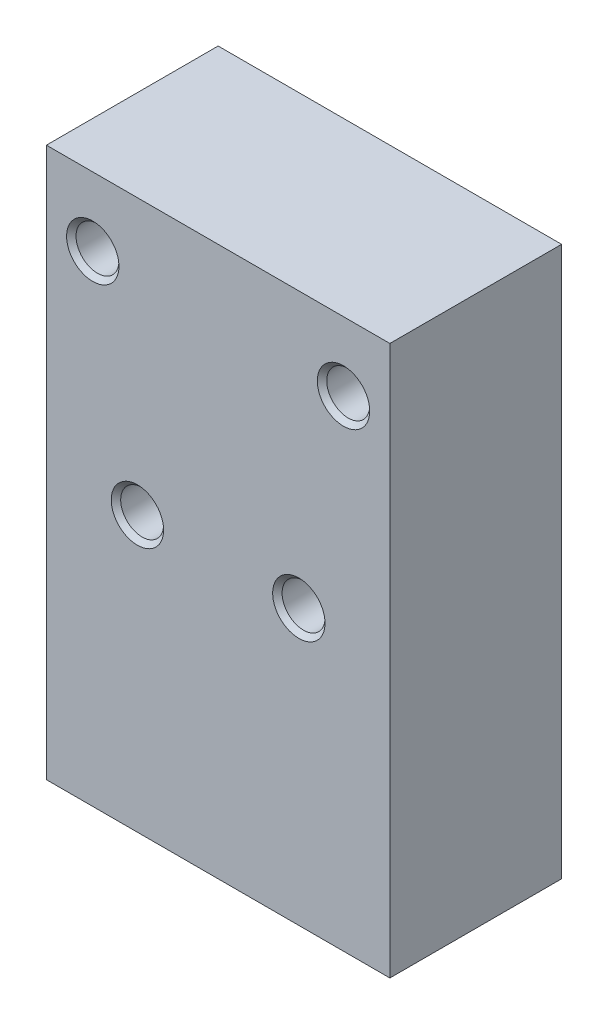
ISO-10303-21;
HEADER;
FILE_DESCRIPTION(('STEP AP214'),'2;1');
FILE_NAME('part.step','',(''),(''),'','','');
FILE_SCHEMA(('AUTOMOTIVE_DESIGN { 1 0 10303 214 1 1 1 1 }'));
ENDSEC;
DATA;
#1=APPLICATION_CONTEXT('core data for automotive mechanical design processes');
#2=APPLICATION_PROTOCOL_DEFINITION('international standard','automotive_design',2000,#1);
#3=PRODUCT_CONTEXT('',#1,'mechanical');
#4=PRODUCT('Part','Part','',(#3));
#5=PRODUCT_RELATED_PRODUCT_CATEGORY('part','',(#4));
#6=PRODUCT_DEFINITION_FORMATION('','',#4);
#7=PRODUCT_DEFINITION_CONTEXT('part definition',#1,'design');
#8=PRODUCT_DEFINITION('design','',#6,#7);
#9=PRODUCT_DEFINITION_SHAPE('','',#8);
#10=(LENGTH_UNIT() NAMED_UNIT(*) SI_UNIT(.MILLI.,.METRE.));
#11=(NAMED_UNIT(*) PLANE_ANGLE_UNIT() SI_UNIT($,.RADIAN.));
#12=(NAMED_UNIT(*) SI_UNIT($,.STERADIAN.) SOLID_ANGLE_UNIT());
#13=UNCERTAINTY_MEASURE_WITH_UNIT(LENGTH_MEASURE(1.E-05),#10,'distance_accuracy_value','');
#14=(GEOMETRIC_REPRESENTATION_CONTEXT(3) GLOBAL_UNCERTAINTY_ASSIGNED_CONTEXT((#13)) GLOBAL_UNIT_ASSIGNED_CONTEXT((#10,
#11,#12)) REPRESENTATION_CONTEXT('',''));
#15=CARTESIAN_POINT('',(0.,0.,0.));
#16=DIRECTION('',(0.,0.,1.));
#17=DIRECTION('',(1.,0.,0.));
#18=AXIS2_PLACEMENT_3D('',#15,#16,#17);
#19=CARTESIAN_POINT('',(20.,28.,2.));
#20=DIRECTION('',(0.,0.,-1.));
#21=DIRECTION('',(0.,1.,0.));
#22=AXIS2_PLACEMENT_3D('',#19,#20,#21);
#23=PLANE('',#22);
#24=CARTESIAN_POINT('',(5.3,14.,2.));
#25=DIRECTION('',(0.,0.,1.));
#26=DIRECTION('',(0.,-1.,0.));
#27=AXIS2_PLACEMENT_3D('',#24,#25,#26);
#28=CIRCLE('',#27,1.525);
#29=CARTESIAN_POINT('',(5.3,12.475,2.));
#30=VERTEX_POINT('',#29);
#31=EDGE_CURVE('E110',#30,#30,#28,.T.);
#32=ORIENTED_EDGE('',*,*,#31,.F.);
#33=EDGE_LOOP('',(#32));
#34=FACE_BOUND('',#33,.T.);
#35=CARTESIAN_POINT('',(17.3,26.,2.));
#36=DIRECTION('',(0.,0.,1.));
#37=DIRECTION('',(0.,-1.,0.));
#38=AXIS2_PLACEMENT_3D('',#35,#36,#37);
#39=CIRCLE('',#38,1.525);
#40=CARTESIAN_POINT('',(17.3,24.475,2.));
#41=VERTEX_POINT('',#40);
#42=EDGE_CURVE('E120',#41,#41,#39,.T.);
#43=ORIENTED_EDGE('',*,*,#42,.F.);
#44=EDGE_LOOP('',(#43));
#45=FACE_BOUND('',#44,.T.);
#46=CARTESIAN_POINT('',(14.7,14.,2.));
#47=DIRECTION('',(0.,0.,1.));
#48=DIRECTION('',(0.,-1.,0.));
#49=AXIS2_PLACEMENT_3D('',#46,#47,#48);
#50=CIRCLE('',#49,1.525);
#51=CARTESIAN_POINT('',(14.7,12.475,2.));
#52=VERTEX_POINT('',#51);
#53=EDGE_CURVE('E129',#52,#52,#50,.T.);
#54=ORIENTED_EDGE('',*,*,#53,.F.);
#55=EDGE_LOOP('',(#54));
#56=FACE_BOUND('',#55,.T.);
#57=CARTESIAN_POINT('',(2.7,26.,2.));
#58=DIRECTION('',(0.,0.,1.));
#59=DIRECTION('',(0.,-1.,0.));
#60=AXIS2_PLACEMENT_3D('',#57,#58,#59);
#61=CIRCLE('',#60,1.525);
#62=CARTESIAN_POINT('',(2.7,24.475,2.));
#63=VERTEX_POINT('',#62);
#64=EDGE_CURVE('E138',#63,#63,#61,.T.);
#65=ORIENTED_EDGE('',*,*,#64,.F.);
#66=EDGE_LOOP('',(#65));
#67=FACE_BOUND('',#66,.T.);
#68=DIRECTION('',(0.,-1.,0.));
#69=VECTOR('',#68,1.);
#70=CARTESIAN_POINT('',(20.,28.,2.));
#71=LINE('',#70,#69);
#72=CARTESIAN_POINT('',(20.,30.,2.));
#73=VERTEX_POINT('',#72);
#74=CARTESIAN_POINT('',(20.,-2.,2.));
#75=VERTEX_POINT('',#74);
#76=EDGE_CURVE('E95',#73,#75,#71,.T.);
#77=ORIENTED_EDGE('',*,*,#76,.F.);
#78=DIRECTION('',(1.,0.,0.));
#79=VECTOR('',#78,1.);
#80=CARTESIAN_POINT('',(20.,30.,2.));
#81=LINE('',#80,#79);
#82=CARTESIAN_POINT('',(0.,30.,2.));
#83=VERTEX_POINT('',#82);
#84=EDGE_CURVE('E102',#83,#73,#81,.T.);
#85=ORIENTED_EDGE('',*,*,#84,.F.);
#86=DIRECTION('',(0.,-1.,0.));
#87=VECTOR('',#86,1.);
#88=CARTESIAN_POINT('',(0.,28.,2.));
#89=LINE('',#88,#87);
#90=CARTESIAN_POINT('',(0.,-2.,2.));
#91=VERTEX_POINT('',#90);
#92=EDGE_CURVE('E65',#83,#91,#89,.T.);
#93=ORIENTED_EDGE('',*,*,#92,.T.);
#94=DIRECTION('',(-1.,0.,0.));
#95=VECTOR('',#94,1.);
#96=CARTESIAN_POINT('',(20.,-2.,2.));
#97=LINE('',#96,#95);
#98=EDGE_CURVE('E11',#75,#91,#97,.T.);
#99=ORIENTED_EDGE('',*,*,#98,.F.);
#100=EDGE_LOOP('',(#77,#85,#93,#99));
#101=FACE_BOUND('',#100,.T.);
#102=ADVANCED_FACE('F38',(#34,#45,#56,#67,#101),#23,.F.);
#103=CARTESIAN_POINT('',(20.,-2.,2.));
#104=DIRECTION('',(0.,1.,0.));
#105=DIRECTION('',(0.,0.,1.));
#106=AXIS2_PLACEMENT_3D('',#103,#104,#105);
#107=PLANE('',#106);
#108=CARTESIAN_POINT('',(5.,-2.,-3.));
#109=DIRECTION('',(0.,-1.,0.));
#110=DIRECTION('',(0.,0.,-1.));
#111=AXIS2_PLACEMENT_3D('',#108,#109,#110);
#112=CIRCLE('',#111,1.525);
#113=CARTESIAN_POINT('',(5.,-2.,-4.525));
#114=VERTEX_POINT('',#113);
#115=EDGE_CURVE('E147',#114,#114,#112,.T.);
#116=ORIENTED_EDGE('',*,*,#115,.F.);
#117=EDGE_LOOP('',(#116));
#118=FACE_BOUND('',#117,.T.);
#119=CARTESIAN_POINT('',(15.,-2.,-3.));
#120=DIRECTION('',(0.,-1.,0.));
#121=DIRECTION('',(0.,0.,-1.));
#122=AXIS2_PLACEMENT_3D('',#119,#120,#121);
#123=CIRCLE('',#122,1.525);
#124=CARTESIAN_POINT('',(15.,-2.,-4.525));
#125=VERTEX_POINT('',#124);
#126=EDGE_CURVE('E156',#125,#125,#123,.T.);
#127=ORIENTED_EDGE('',*,*,#126,.F.);
#128=EDGE_LOOP('',(#127));
#129=FACE_BOUND('',#128,.T.);
#130=DIRECTION('',(0.,0.,-1.));
#131=VECTOR('',#130,1.);
#132=CARTESIAN_POINT('',(0.,-2.,2.));
#133=LINE('',#132,#131);
#134=CARTESIAN_POINT('',(0.,-2.,-8.));
#135=VERTEX_POINT('',#134);
#136=EDGE_CURVE('E96',#91,#135,#133,.T.);
#137=ORIENTED_EDGE('',*,*,#136,.T.);
#138=DIRECTION('',(-1.,0.,0.));
#139=VECTOR('',#138,1.);
#140=CARTESIAN_POINT('',(20.,-2.,-8.));
#141=LINE('',#140,#139);
#142=CARTESIAN_POINT('',(20.,-2.,-8.));
#143=VERTEX_POINT('',#142);
#144=EDGE_CURVE('E46',#143,#135,#141,.T.);
#145=ORIENTED_EDGE('',*,*,#144,.F.);
#146=DIRECTION('',(0.,0.,-1.));
#147=VECTOR('',#146,1.);
#148=CARTESIAN_POINT('',(20.,-2.,2.));
#149=LINE('',#148,#147);
#150=EDGE_CURVE('E54',#75,#143,#149,.T.);
#151=ORIENTED_EDGE('',*,*,#150,.F.);
#152=ORIENTED_EDGE('',*,*,#98,.T.);
#153=EDGE_LOOP('',(#137,#145,#151,#152));
#154=FACE_BOUND('',#153,.T.);
#155=ADVANCED_FACE('F171',(#118,#129,#154),#107,.F.);
#156=CARTESIAN_POINT('',(20.,28.,-8.));
#157=DIRECTION('',(0.,0.,1.));
#158=DIRECTION('',(1.,0.,0.));
#159=AXIS2_PLACEMENT_3D('',#156,#157,#158);
#160=PLANE('',#159);
#161=CARTESIAN_POINT('',(5.3,14.,-8.));
#162=DIRECTION('',(0.,0.,1.));
#163=DIRECTION('',(0.,-1.,0.));
#164=AXIS2_PLACEMENT_3D('',#161,#162,#163);
#165=CIRCLE('',#164,1.25);
#166=CARTESIAN_POINT('',(5.3,12.75,-8.));
#167=VERTEX_POINT('',#166);
#168=EDGE_CURVE('E117',#167,#167,#165,.T.);
#169=ORIENTED_EDGE('',*,*,#168,.T.);
#170=EDGE_LOOP('',(#169));
#171=FACE_BOUND('',#170,.T.);
#172=CARTESIAN_POINT('',(17.3,26.,-8.));
#173=DIRECTION('',(0.,0.,1.));
#174=DIRECTION('',(0.,-1.,0.));
#175=AXIS2_PLACEMENT_3D('',#172,#173,#174);
#176=CIRCLE('',#175,1.25);
#177=CARTESIAN_POINT('',(17.3,24.75,-8.));
#178=VERTEX_POINT('',#177);
#179=EDGE_CURVE('E126',#178,#178,#176,.T.);
#180=ORIENTED_EDGE('',*,*,#179,.T.);
#181=EDGE_LOOP('',(#180));
#182=FACE_BOUND('',#181,.T.);
#183=CARTESIAN_POINT('',(14.7,14.,-8.));
#184=DIRECTION('',(0.,0.,1.));
#185=DIRECTION('',(0.,-1.,0.));
#186=AXIS2_PLACEMENT_3D('',#183,#184,#185);
#187=CIRCLE('',#186,1.25);
#188=CARTESIAN_POINT('',(14.7,12.75,-8.));
#189=VERTEX_POINT('',#188);
#190=EDGE_CURVE('E135',#189,#189,#187,.T.);
#191=ORIENTED_EDGE('',*,*,#190,.T.);
#192=EDGE_LOOP('',(#191));
#193=FACE_BOUND('',#192,.T.);
#194=CARTESIAN_POINT('',(2.7,26.,-8.));
#195=DIRECTION('',(0.,0.,1.));
#196=DIRECTION('',(0.,-1.,0.));
#197=AXIS2_PLACEMENT_3D('',#194,#195,#196);
#198=CIRCLE('',#197,1.25);
#199=CARTESIAN_POINT('',(2.7,24.75,-8.));
#200=VERTEX_POINT('',#199);
#201=EDGE_CURVE('E144',#200,#200,#198,.T.);
#202=ORIENTED_EDGE('',*,*,#201,.T.);
#203=EDGE_LOOP('',(#202));
#204=FACE_BOUND('',#203,.T.);
#205=DIRECTION('',(0.,1.,0.));
#206=VECTOR('',#205,1.);
#207=CARTESIAN_POINT('',(0.,28.,-8.));
#208=LINE('',#207,#206);
#209=CARTESIAN_POINT('',(0.,30.,-8.));
#210=VERTEX_POINT('',#209);
#211=EDGE_CURVE('E86',#135,#210,#208,.T.);
#212=ORIENTED_EDGE('',*,*,#211,.T.);
#213=DIRECTION('',(1.,0.,0.));
#214=VECTOR('',#213,1.);
#215=CARTESIAN_POINT('',(20.,30.,-8.));
#216=LINE('',#215,#214);
#217=CARTESIAN_POINT('',(20.,30.,-8.));
#218=VERTEX_POINT('',#217);
#219=EDGE_CURVE('E91',#210,#218,#216,.T.);
#220=ORIENTED_EDGE('',*,*,#219,.T.);
#221=DIRECTION('',(0.,1.,0.));
#222=VECTOR('',#221,1.);
#223=CARTESIAN_POINT('',(20.,-2.,-8.));
#224=LINE('',#223,#222);
#225=EDGE_CURVE('E167',#143,#218,#224,.T.);
#226=ORIENTED_EDGE('',*,*,#225,.F.);
#227=ORIENTED_EDGE('',*,*,#144,.T.);
#228=EDGE_LOOP('',(#212,#220,#226,#227));
#229=FACE_BOUND('',#228,.T.);
#230=ADVANCED_FACE('F88',(#171,#182,#193,#204,#229),#160,.F.);
#231=CARTESIAN_POINT('',(20.,0.,0.));
#232=DIRECTION('',(-1.,0.,0.));
#233=DIRECTION('',(0.,0.,1.));
#234=AXIS2_PLACEMENT_3D('',#231,#232,#233);
#235=PLANE('',#234);
#236=ORIENTED_EDGE('',*,*,#225,.T.);
#237=DIRECTION('',(0.,0.,1.));
#238=VECTOR('',#237,1.);
#239=CARTESIAN_POINT('',(20.,30.,-8.));
#240=LINE('',#239,#238);
#241=EDGE_CURVE('E101',#218,#73,#240,.T.);
#242=ORIENTED_EDGE('',*,*,#241,.T.);
#243=ORIENTED_EDGE('',*,*,#76,.T.);
#244=ORIENTED_EDGE('',*,*,#150,.T.);
#245=EDGE_LOOP('',(#236,#242,#243,#244));
#246=FACE_BOUND('',#245,.T.);
#247=ADVANCED_FACE('F173',(#246),#235,.F.);
#248=CARTESIAN_POINT('',(0.,0.,0.));
#249=DIRECTION('',(-1.,0.,0.));
#250=DIRECTION('',(0.,0.,1.));
#251=AXIS2_PLACEMENT_3D('',#248,#249,#250);
#252=PLANE('',#251);
#253=DIRECTION('',(0.,0.,1.));
#254=VECTOR('',#253,1.);
#255=CARTESIAN_POINT('',(0.,30.,-8.));
#256=LINE('',#255,#254);
#257=EDGE_CURVE('E98',#210,#83,#256,.T.);
#258=ORIENTED_EDGE('',*,*,#257,.F.);
#259=ORIENTED_EDGE('',*,*,#211,.F.);
#260=ORIENTED_EDGE('',*,*,#136,.F.);
#261=ORIENTED_EDGE('',*,*,#92,.F.);
#262=EDGE_LOOP('',(#258,#259,#260,#261));
#263=FACE_BOUND('',#262,.T.);
#264=ADVANCED_FACE('F99',(#263),#252,.T.);
#265=CARTESIAN_POINT('',(15.,8.,-3.));
#266=DIRECTION('',(0.,-1.,0.));
#267=DIRECTION('',(0.,0.,-1.));
#268=AXIS2_PLACEMENT_3D('',#265,#266,#267);
#269=CONICAL_SURFACE('',#268,1.25,1.02974425867665);
#270=CARTESIAN_POINT('',(15.,8.75107577378445,-3.));
#271=VERTEX_POINT('',#270);
#272=VERTEX_LOOP('',#271);
#273=FACE_BOUND('',#272,.T.);
#274=CARTESIAN_POINT('',(15.,8.,-3.));
#275=DIRECTION('',(0.,-1.,0.));
#276=DIRECTION('',(0.,0.,-1.));
#277=AXIS2_PLACEMENT_3D('',#274,#275,#276);
#278=CIRCLE('',#277,1.25);
#279=CARTESIAN_POINT('',(15.,8.,-4.24999999999999));
#280=VERTEX_POINT('',#279);
#281=EDGE_CURVE('E162',#280,#280,#278,.T.);
#282=ORIENTED_EDGE('',*,*,#281,.T.);
#283=EDGE_LOOP('',(#282));
#284=FACE_BOUND('',#283,.T.);
#285=ADVANCED_FACE('F180',(#273,#284),#269,.F.);
#286=CARTESIAN_POINT('',(15.,-2.,-3.));
#287=DIRECTION('',(0.,-1.,0.));
#288=DIRECTION('',(0.,0.,-1.));
#289=AXIS2_PLACEMENT_3D('',#286,#287,#288);
#290=CYLINDRICAL_SURFACE('',#289,1.25);
#291=ORIENTED_EDGE('',*,*,#281,.F.);
#292=EDGE_LOOP('',(#291));
#293=FACE_BOUND('',#292,.T.);
#294=CARTESIAN_POINT('',(15.,-1.725,-3.));
#295=DIRECTION('',(0.,-1.,0.));
#296=DIRECTION('',(0.,0.,-1.));
#297=AXIS2_PLACEMENT_3D('',#294,#295,#296);
#298=CIRCLE('',#297,1.25);
#299=CARTESIAN_POINT('',(15.,-1.725,-4.24999999999999));
#300=VERTEX_POINT('',#299);
#301=EDGE_CURVE('E159',#300,#300,#298,.T.);
#302=ORIENTED_EDGE('',*,*,#301,.T.);
#303=EDGE_LOOP('',(#302));
#304=FACE_BOUND('',#303,.T.);
#305=ADVANCED_FACE('F232',(#293,#304),#290,.F.);
#306=CARTESIAN_POINT('',(15.,-2.,-3.));
#307=DIRECTION('',(0.,-1.,0.));
#308=DIRECTION('',(0.,0.,-1.));
#309=AXIS2_PLACEMENT_3D('',#306,#307,#308);
#310=CONICAL_SURFACE('',#309,1.525,0.785398163397451);
#311=ORIENTED_EDGE('',*,*,#301,.F.);
#312=EDGE_LOOP('',(#311));
#313=FACE_BOUND('',#312,.T.);
#314=ORIENTED_EDGE('',*,*,#126,.T.);
#315=EDGE_LOOP('',(#314));
#316=FACE_BOUND('',#315,.T.);
#317=ADVANCED_FACE('F228',(#313,#316),#310,.F.);
#318=CARTESIAN_POINT('',(5.,8.,-3.));
#319=DIRECTION('',(0.,-1.,0.));
#320=DIRECTION('',(0.,0.,-1.));
#321=AXIS2_PLACEMENT_3D('',#318,#319,#320);
#322=CONICAL_SURFACE('',#321,1.25,1.02974425867665);
#323=CARTESIAN_POINT('',(5.,8.75107577378445,-3.));
#324=VERTEX_POINT('',#323);
#325=VERTEX_LOOP('',#324);
#326=FACE_BOUND('',#325,.T.);
#327=CARTESIAN_POINT('',(5.,8.,-3.));
#328=DIRECTION('',(0.,-1.,0.));
#329=DIRECTION('',(0.,0.,-1.));
#330=AXIS2_PLACEMENT_3D('',#327,#328,#329);
#331=CIRCLE('',#330,1.25);
#332=CARTESIAN_POINT('',(5.,8.,-4.25));
#333=VERTEX_POINT('',#332);
#334=EDGE_CURVE('E153',#333,#333,#331,.T.);
#335=ORIENTED_EDGE('',*,*,#334,.T.);
#336=EDGE_LOOP('',(#335));
#337=FACE_BOUND('',#336,.T.);
#338=ADVANCED_FACE('F224',(#326,#337),#322,.F.);
#339=CARTESIAN_POINT('',(5.,-2.,-3.));
#340=DIRECTION('',(0.,-1.,0.));
#341=DIRECTION('',(0.,0.,-1.));
#342=AXIS2_PLACEMENT_3D('',#339,#340,#341);
#343=CYLINDRICAL_SURFACE('',#342,1.25);
#344=ORIENTED_EDGE('',*,*,#334,.F.);
#345=EDGE_LOOP('',(#344));
#346=FACE_BOUND('',#345,.T.);
#347=CARTESIAN_POINT('',(5.,-1.725,-3.));
#348=DIRECTION('',(0.,-1.,0.));
#349=DIRECTION('',(0.,0.,-1.));
#350=AXIS2_PLACEMENT_3D('',#347,#348,#349);
#351=CIRCLE('',#350,1.25);
#352=CARTESIAN_POINT('',(5.,-1.725,-4.25));
#353=VERTEX_POINT('',#352);
#354=EDGE_CURVE('E150',#353,#353,#351,.T.);
#355=ORIENTED_EDGE('',*,*,#354,.T.);
#356=EDGE_LOOP('',(#355));
#357=FACE_BOUND('',#356,.T.);
#358=ADVANCED_FACE('F220',(#346,#357),#343,.F.);
#359=CARTESIAN_POINT('',(5.,-2.,-3.));
#360=DIRECTION('',(0.,-1.,0.));
#361=DIRECTION('',(0.,0.,-1.));
#362=AXIS2_PLACEMENT_3D('',#359,#360,#361);
#363=CONICAL_SURFACE('',#362,1.525,0.785398163397445);
#364=ORIENTED_EDGE('',*,*,#354,.F.);
#365=EDGE_LOOP('',(#364));
#366=FACE_BOUND('',#365,.T.);
#367=ORIENTED_EDGE('',*,*,#115,.T.);
#368=EDGE_LOOP('',(#367));
#369=FACE_BOUND('',#368,.T.);
#370=ADVANCED_FACE('F212',(#366,#369),#363,.F.);
#371=CARTESIAN_POINT('',(2.7,26.,2.));
#372=DIRECTION('',(0.,0.,1.));
#373=DIRECTION('',(0.,-1.,0.));
#374=AXIS2_PLACEMENT_3D('',#371,#372,#373);
#375=CYLINDRICAL_SURFACE('',#374,1.25);
#376=ORIENTED_EDGE('',*,*,#201,.F.);
#377=EDGE_LOOP('',(#376));
#378=FACE_BOUND('',#377,.T.);
#379=CARTESIAN_POINT('',(2.7,26.,1.725));
#380=DIRECTION('',(0.,0.,1.));
#381=DIRECTION('',(0.,-1.,0.));
#382=AXIS2_PLACEMENT_3D('',#379,#380,#381);
#383=CIRCLE('',#382,1.25);
#384=CARTESIAN_POINT('',(2.7,24.75,1.725));
#385=VERTEX_POINT('',#384);
#386=EDGE_CURVE('E141',#385,#385,#383,.T.);
#387=ORIENTED_EDGE('',*,*,#386,.T.);
#388=EDGE_LOOP('',(#387));
#389=FACE_BOUND('',#388,.T.);
#390=ADVANCED_FACE('F202',(#378,#389),#375,.F.);
#391=CARTESIAN_POINT('',(2.7,26.,2.));
#392=DIRECTION('',(0.,0.,1.));
#393=DIRECTION('',(0.,-1.,0.));
#394=AXIS2_PLACEMENT_3D('',#391,#392,#393);
#395=CONICAL_SURFACE('',#394,1.525,0.785398163397447);
#396=ORIENTED_EDGE('',*,*,#386,.F.);
#397=EDGE_LOOP('',(#396));
#398=FACE_BOUND('',#397,.T.);
#399=ORIENTED_EDGE('',*,*,#64,.T.);
#400=EDGE_LOOP('',(#399));
#401=FACE_BOUND('',#400,.T.);
#402=ADVANCED_FACE('F199',(#398,#401),#395,.F.);
#403=CARTESIAN_POINT('',(14.7,14.,2.));
#404=DIRECTION('',(0.,0.,1.));
#405=DIRECTION('',(0.,-1.,0.));
#406=AXIS2_PLACEMENT_3D('',#403,#404,#405);
#407=CYLINDRICAL_SURFACE('',#406,1.25);
#408=ORIENTED_EDGE('',*,*,#190,.F.);
#409=EDGE_LOOP('',(#408));
#410=FACE_BOUND('',#409,.T.);
#411=CARTESIAN_POINT('',(14.7,14.,1.725));
#412=DIRECTION('',(0.,0.,1.));
#413=DIRECTION('',(0.,-1.,0.));
#414=AXIS2_PLACEMENT_3D('',#411,#412,#413);
#415=CIRCLE('',#414,1.25);
#416=CARTESIAN_POINT('',(14.7,12.75,1.725));
#417=VERTEX_POINT('',#416);
#418=EDGE_CURVE('E132',#417,#417,#415,.T.);
#419=ORIENTED_EDGE('',*,*,#418,.T.);
#420=EDGE_LOOP('',(#419));
#421=FACE_BOUND('',#420,.T.);
#422=ADVANCED_FACE('F201',(#410,#421),#407,.F.);
#423=CARTESIAN_POINT('',(14.7,14.,2.));
#424=DIRECTION('',(0.,0.,1.));
#425=DIRECTION('',(0.,-1.,0.));
#426=AXIS2_PLACEMENT_3D('',#423,#424,#425);
#427=CONICAL_SURFACE('',#426,1.525,0.785398163397453);
#428=ORIENTED_EDGE('',*,*,#418,.F.);
#429=EDGE_LOOP('',(#428));
#430=FACE_BOUND('',#429,.T.);
#431=ORIENTED_EDGE('',*,*,#53,.T.);
#432=EDGE_LOOP('',(#431));
#433=FACE_BOUND('',#432,.T.);
#434=ADVANCED_FACE('F209',(#430,#433),#427,.F.);
#435=CARTESIAN_POINT('',(17.3,26.,2.));
#436=DIRECTION('',(0.,0.,1.));
#437=DIRECTION('',(0.,-1.,0.));
#438=AXIS2_PLACEMENT_3D('',#435,#436,#437);
#439=CYLINDRICAL_SURFACE('',#438,1.24999999999999);
#440=ORIENTED_EDGE('',*,*,#179,.F.);
#441=EDGE_LOOP('',(#440));
#442=FACE_BOUND('',#441,.T.);
#443=CARTESIAN_POINT('',(17.3,26.,1.72499999999999));
#444=DIRECTION('',(0.,0.,1.));
#445=DIRECTION('',(0.,-1.,0.));
#446=AXIS2_PLACEMENT_3D('',#443,#444,#445);
#447=CIRCLE('',#446,1.24999999999999);
#448=CARTESIAN_POINT('',(17.3,24.75,1.72499999999999));
#449=VERTEX_POINT('',#448);
#450=EDGE_CURVE('E123',#449,#449,#447,.T.);
#451=ORIENTED_EDGE('',*,*,#450,.T.);
#452=EDGE_LOOP('',(#451));
#453=FACE_BOUND('',#452,.T.);
#454=ADVANCED_FACE('F283',(#442,#453),#439,.F.);
#455=CARTESIAN_POINT('',(17.3,26.,2.));
#456=DIRECTION('',(0.,0.,1.));
#457=DIRECTION('',(0.,-1.,0.));
#458=AXIS2_PLACEMENT_3D('',#455,#456,#457);
#459=CONICAL_SURFACE('',#458,1.525,0.785398163397445);
#460=ORIENTED_EDGE('',*,*,#450,.F.);
#461=EDGE_LOOP('',(#460));
#462=FACE_BOUND('',#461,.T.);
#463=ORIENTED_EDGE('',*,*,#42,.T.);
#464=EDGE_LOOP('',(#463));
#465=FACE_BOUND('',#464,.T.);
#466=ADVANCED_FACE('F288',(#462,#465),#459,.F.);
#467=CARTESIAN_POINT('',(5.3,14.,2.));
#468=DIRECTION('',(0.,0.,1.));
#469=DIRECTION('',(0.,-1.,0.));
#470=AXIS2_PLACEMENT_3D('',#467,#468,#469);
#471=CYLINDRICAL_SURFACE('',#470,1.24999999999999);
#472=ORIENTED_EDGE('',*,*,#168,.F.);
#473=EDGE_LOOP('',(#472));
#474=FACE_BOUND('',#473,.T.);
#475=CARTESIAN_POINT('',(5.3,14.,1.72499999999999));
#476=DIRECTION('',(0.,0.,1.));
#477=DIRECTION('',(0.,-1.,0.));
#478=AXIS2_PLACEMENT_3D('',#475,#476,#477);
#479=CIRCLE('',#478,1.24999999999999);
#480=CARTESIAN_POINT('',(5.3,12.75,1.72499999999999));
#481=VERTEX_POINT('',#480);
#482=EDGE_CURVE('E114',#481,#481,#479,.T.);
#483=ORIENTED_EDGE('',*,*,#482,.T.);
#484=EDGE_LOOP('',(#483));
#485=FACE_BOUND('',#484,.T.);
#486=ADVANCED_FACE('F298',(#474,#485),#471,.F.);
#487=CARTESIAN_POINT('',(5.3,14.,2.));
#488=DIRECTION('',(0.,0.,1.));
#489=DIRECTION('',(0.,-1.,0.));
#490=AXIS2_PLACEMENT_3D('',#487,#488,#489);
#491=CONICAL_SURFACE('',#490,1.525,0.785398163397448);
#492=ORIENTED_EDGE('',*,*,#482,.F.);
#493=EDGE_LOOP('',(#492));
#494=FACE_BOUND('',#493,.T.);
#495=ORIENTED_EDGE('',*,*,#31,.T.);
#496=EDGE_LOOP('',(#495));
#497=FACE_BOUND('',#496,.T.);
#498=ADVANCED_FACE('F302',(#494,#497),#491,.F.);
#499=CARTESIAN_POINT('',(20.,30.,-8.));
#500=DIRECTION('',(0.,-1.,0.));
#501=DIRECTION('',(1.,0.,0.));
#502=AXIS2_PLACEMENT_3D('',#499,#500,#501);
#503=PLANE('',#502);
#504=ORIENTED_EDGE('',*,*,#257,.T.);
#505=ORIENTED_EDGE('',*,*,#84,.T.);
#506=ORIENTED_EDGE('',*,*,#241,.F.);
#507=ORIENTED_EDGE('',*,*,#219,.F.);
#508=EDGE_LOOP('',(#504,#505,#506,#507));
#509=FACE_BOUND('',#508,.T.);
#510=ADVANCED_FACE('F105',(#509),#503,.F.);
#511=CLOSED_SHELL('',(#102,#155,#230,#247,#264,#285,#305,#317,#338,#358,#370,#390,#402,#422,
#434,#454,#466,#486,#498,#510));
#512=MANIFOLD_SOLID_BREP('B2',#511);
#513=ADVANCED_BREP_SHAPE_REPRESENTATION('',(#18,#512),#14);
#514=SHAPE_DEFINITION_REPRESENTATION(#9,#513);
ENDSEC;
END-ISO-10303-21;
